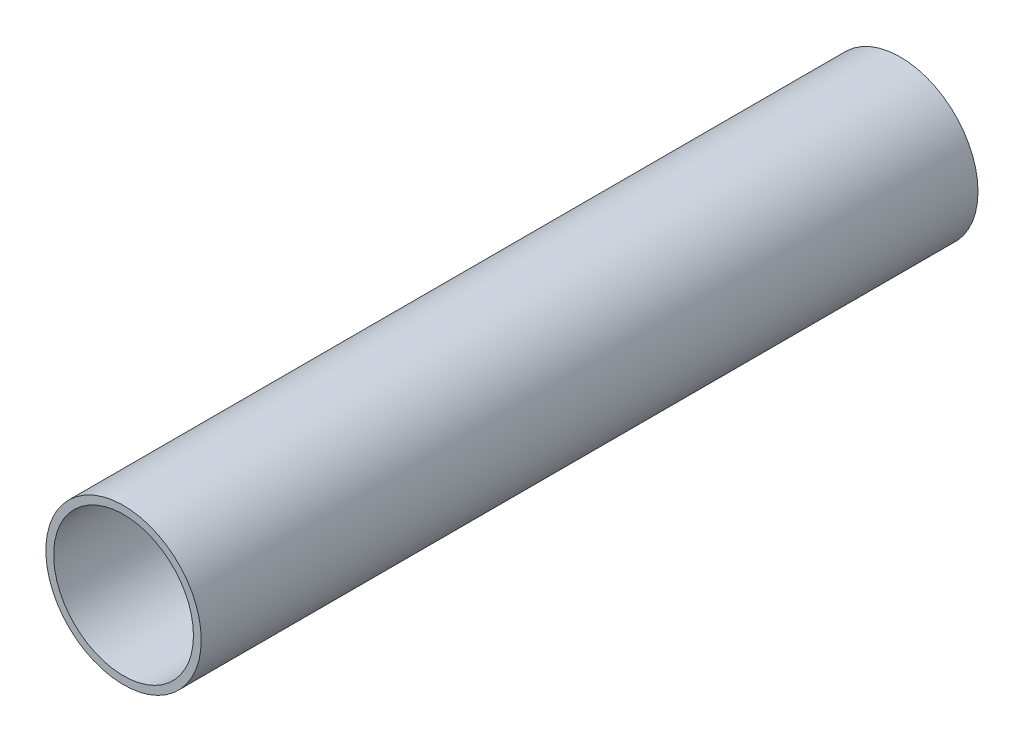
ISO-10303-21;
HEADER;
FILE_DESCRIPTION(('STEP AP214'),'2;1');
FILE_NAME('part.step','',(''),(''),'','','');
FILE_SCHEMA(('AUTOMOTIVE_DESIGN { 1 0 10303 214 1 1 1 1 }'));
ENDSEC;
DATA;
#1=APPLICATION_CONTEXT('core data for automotive mechanical design processes');
#2=APPLICATION_PROTOCOL_DEFINITION('international standard','automotive_design',2000,#1);
#3=PRODUCT_CONTEXT('',#1,'mechanical');
#4=PRODUCT('Part','Part','',(#3));
#5=PRODUCT_RELATED_PRODUCT_CATEGORY('part','',(#4));
#6=PRODUCT_DEFINITION_FORMATION('','',#4);
#7=PRODUCT_DEFINITION_CONTEXT('part definition',#1,'design');
#8=PRODUCT_DEFINITION('design','',#6,#7);
#9=PRODUCT_DEFINITION_SHAPE('','',#8);
#10=(LENGTH_UNIT() NAMED_UNIT(*) SI_UNIT(.MILLI.,.METRE.));
#11=(NAMED_UNIT(*) PLANE_ANGLE_UNIT() SI_UNIT($,.RADIAN.));
#12=(NAMED_UNIT(*) SI_UNIT($,.STERADIAN.) SOLID_ANGLE_UNIT());
#13=UNCERTAINTY_MEASURE_WITH_UNIT(LENGTH_MEASURE(1.E-05),#10,'distance_accuracy_value','');
#14=(GEOMETRIC_REPRESENTATION_CONTEXT(3) GLOBAL_UNCERTAINTY_ASSIGNED_CONTEXT((#13)) GLOBAL_UNIT_ASSIGNED_CONTEXT((#10,
#11,#12)) REPRESENTATION_CONTEXT('',''));
#15=CARTESIAN_POINT('',(0.,0.,0.));
#16=DIRECTION('',(0.,0.,1.));
#17=DIRECTION('',(1.,0.,0.));
#18=AXIS2_PLACEMENT_3D('',#15,#16,#17);
#19=CARTESIAN_POINT('',(0.,0.,40.));
#20=DIRECTION('',(0.,0.,-1.));
#21=DIRECTION('',(-1.,0.,0.));
#22=AXIS2_PLACEMENT_3D('',#19,#20,#21);
#23=CYLINDRICAL_SURFACE('',#22,7.2);
#24=CARTESIAN_POINT('',(0.,0.,40.));
#25=DIRECTION('',(0.,0.,1.));
#26=DIRECTION('',(1.,0.,0.));
#27=AXIS2_PLACEMENT_3D('',#24,#25,#26);
#28=CIRCLE('',#27,7.2);
#29=CARTESIAN_POINT('',(7.2,0.,40.));
#30=VERTEX_POINT('',#29);
#31=EDGE_CURVE('E37',#30,#30,#28,.T.);
#32=ORIENTED_EDGE('',*,*,#31,.T.);
#33=EDGE_LOOP('',(#32));
#34=FACE_BOUND('',#33,.T.);
#35=CARTESIAN_POINT('',(0.,0.,-40.));
#36=DIRECTION('',(0.,0.,1.));
#37=DIRECTION('',(1.,0.,0.));
#38=AXIS2_PLACEMENT_3D('',#35,#36,#37);
#39=CIRCLE('',#38,7.2);
#40=CARTESIAN_POINT('',(7.2,0.,-40.));
#41=VERTEX_POINT('',#40);
#42=EDGE_CURVE('E43',#41,#41,#39,.T.);
#43=ORIENTED_EDGE('',*,*,#42,.F.);
#44=EDGE_LOOP('',(#43));
#45=FACE_BOUND('',#44,.T.);
#46=ADVANCED_FACE('F30',(#34,#45),#23,.F.);
#47=CARTESIAN_POINT('',(0.,0.,40.));
#48=DIRECTION('',(0.,0.,-1.));
#49=DIRECTION('',(-1.,0.,0.));
#50=AXIS2_PLACEMENT_3D('',#47,#48,#49);
#51=CYLINDRICAL_SURFACE('',#50,8.);
#52=CARTESIAN_POINT('',(0.,0.,40.));
#53=DIRECTION('',(0.,0.,1.));
#54=DIRECTION('',(1.,0.,0.));
#55=AXIS2_PLACEMENT_3D('',#52,#53,#54);
#56=CIRCLE('',#55,8.);
#57=CARTESIAN_POINT('',(8.,0.,40.));
#58=VERTEX_POINT('',#57);
#59=EDGE_CURVE('E10',#58,#58,#56,.T.);
#60=ORIENTED_EDGE('',*,*,#59,.F.);
#61=EDGE_LOOP('',(#60));
#62=FACE_BOUND('',#61,.T.);
#63=CARTESIAN_POINT('',(0.,0.,-40.));
#64=DIRECTION('',(0.,0.,1.));
#65=DIRECTION('',(1.,0.,0.));
#66=AXIS2_PLACEMENT_3D('',#63,#64,#65);
#67=CIRCLE('',#66,8.);
#68=CARTESIAN_POINT('',(8.,0.,-40.));
#69=VERTEX_POINT('',#68);
#70=EDGE_CURVE('E33',#69,#69,#67,.T.);
#71=ORIENTED_EDGE('',*,*,#70,.T.);
#72=EDGE_LOOP('',(#71));
#73=FACE_BOUND('',#72,.T.);
#74=ADVANCED_FACE('F50',(#62,#73),#51,.T.);
#75=CARTESIAN_POINT('',(0.,0.,40.));
#76=DIRECTION('',(0.,0.,1.));
#77=DIRECTION('',(1.,0.,0.));
#78=AXIS2_PLACEMENT_3D('',#75,#76,#77);
#79=PLANE('',#78);
#80=ORIENTED_EDGE('',*,*,#31,.F.);
#81=EDGE_LOOP('',(#80));
#82=FACE_BOUND('',#81,.T.);
#83=ORIENTED_EDGE('',*,*,#59,.T.);
#84=EDGE_LOOP('',(#83));
#85=FACE_BOUND('',#84,.T.);
#86=ADVANCED_FACE('F54',(#82,#85),#79,.T.);
#87=CARTESIAN_POINT('',(0.,0.,-40.));
#88=DIRECTION('',(0.,0.,1.));
#89=DIRECTION('',(1.,0.,0.));
#90=AXIS2_PLACEMENT_3D('',#87,#88,#89);
#91=PLANE('',#90);
#92=ORIENTED_EDGE('',*,*,#42,.T.);
#93=EDGE_LOOP('',(#92));
#94=FACE_BOUND('',#93,.T.);
#95=ORIENTED_EDGE('',*,*,#70,.F.);
#96=EDGE_LOOP('',(#95));
#97=FACE_BOUND('',#96,.T.);
#98=ADVANCED_FACE('F52',(#94,#97),#91,.F.);
#99=CLOSED_SHELL('',(#46,#74,#86,#98));
#100=MANIFOLD_SOLID_BREP('B2',#99);
#101=ADVANCED_BREP_SHAPE_REPRESENTATION('',(#18,#100),#14);
#102=SHAPE_DEFINITION_REPRESENTATION(#9,#101);
ENDSEC;
END-ISO-10303-21;
